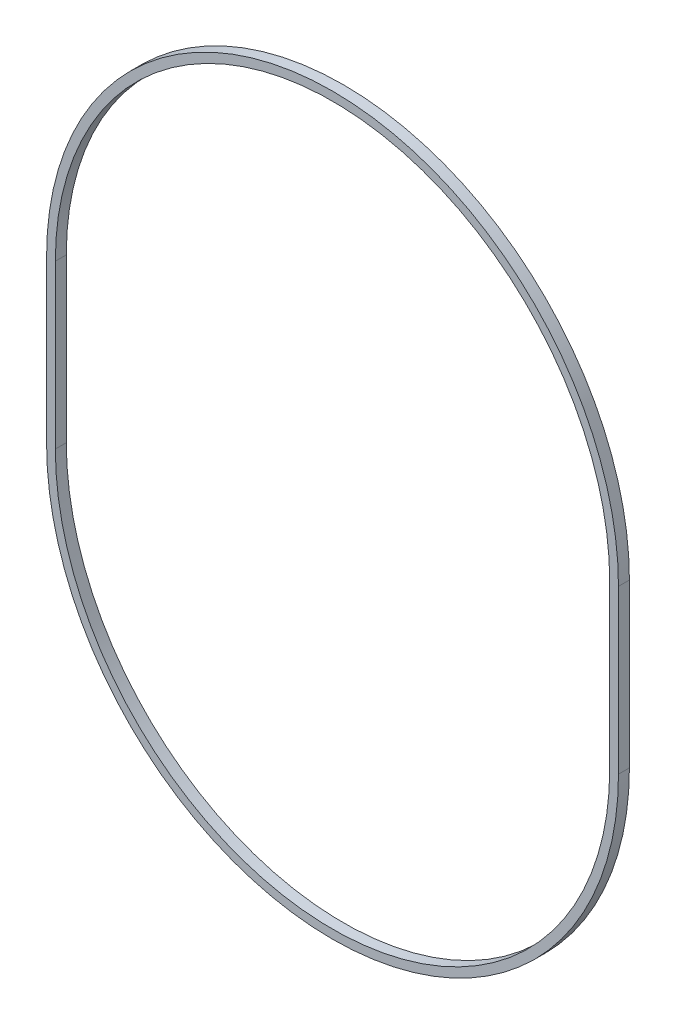
ISO-10303-21;
HEADER;
FILE_DESCRIPTION(('STEP AP214'),'2;1');
FILE_NAME('part.step','',(''),(''),'','','');
FILE_SCHEMA(('AUTOMOTIVE_DESIGN { 1 0 10303 214 1 1 1 1 }'));
ENDSEC;
DATA;
#1=APPLICATION_CONTEXT('core data for automotive mechanical design processes');
#2=APPLICATION_PROTOCOL_DEFINITION('international standard','automotive_design',2000,#1);
#3=PRODUCT_CONTEXT('',#1,'mechanical');
#4=PRODUCT('Part','Part','',(#3));
#5=PRODUCT_RELATED_PRODUCT_CATEGORY('part','',(#4));
#6=PRODUCT_DEFINITION_FORMATION('','',#4);
#7=PRODUCT_DEFINITION_CONTEXT('part definition',#1,'design');
#8=PRODUCT_DEFINITION('design','',#6,#7);
#9=PRODUCT_DEFINITION_SHAPE('','',#8);
#10=(LENGTH_UNIT() NAMED_UNIT(*) SI_UNIT(.MILLI.,.METRE.));
#11=(NAMED_UNIT(*) PLANE_ANGLE_UNIT() SI_UNIT($,.RADIAN.));
#12=(NAMED_UNIT(*) SI_UNIT($,.STERADIAN.) SOLID_ANGLE_UNIT());
#13=UNCERTAINTY_MEASURE_WITH_UNIT(LENGTH_MEASURE(1.E-05),#10,'distance_accuracy_value','');
#14=(GEOMETRIC_REPRESENTATION_CONTEXT(3) GLOBAL_UNCERTAINTY_ASSIGNED_CONTEXT((#13)) GLOBAL_UNIT_ASSIGNED_CONTEXT((#10,
#11,#12)) REPRESENTATION_CONTEXT('',''));
#15=CARTESIAN_POINT('',(0.,0.,0.));
#16=DIRECTION('',(0.,0.,1.));
#17=DIRECTION('',(1.,0.,0.));
#18=AXIS2_PLACEMENT_3D('',#15,#16,#17);
#19=CARTESIAN_POINT('',(-98.,0.,1.875));
#20=DIRECTION('',(1.,0.,0.));
#21=DIRECTION('',(0.,0.,-1.));
#22=AXIS2_PLACEMENT_3D('',#19,#20,#21);
#23=PLANE('',#22);
#24=DIRECTION('',(0.,-1.,0.));
#25=VECTOR('',#24,1.);
#26=CARTESIAN_POINT('',(-98.,0.,-1.875));
#27=LINE('',#26,#25);
#28=CARTESIAN_POINT('',(-98.,27.875,-1.875));
#29=VERTEX_POINT('',#28);
#30=CARTESIAN_POINT('',(-98.,-27.875,-1.875));
#31=VERTEX_POINT('',#30);
#32=EDGE_CURVE('E150',#29,#31,#27,.T.);
#33=ORIENTED_EDGE('',*,*,#32,.T.);
#34=DIRECTION('',(0.,0.,-1.));
#35=VECTOR('',#34,1.);
#36=CARTESIAN_POINT('',(-98.,-27.875,1.875));
#37=LINE('',#36,#35);
#38=CARTESIAN_POINT('',(-98.,-27.875,1.875));
#39=VERTEX_POINT('',#38);
#40=EDGE_CURVE('E11',#39,#31,#37,.T.);
#41=ORIENTED_EDGE('',*,*,#40,.F.);
#42=DIRECTION('',(0.,-1.,0.));
#43=VECTOR('',#42,1.);
#44=CARTESIAN_POINT('',(-98.,0.,1.875));
#45=LINE('',#44,#43);
#46=CARTESIAN_POINT('',(-98.,27.875,1.875));
#47=VERTEX_POINT('',#46);
#48=EDGE_CURVE('E124',#47,#39,#45,.T.);
#49=ORIENTED_EDGE('',*,*,#48,.F.);
#50=DIRECTION('',(0.,0.,-1.));
#51=VECTOR('',#50,1.);
#52=CARTESIAN_POINT('',(-98.,27.875,1.875));
#53=LINE('',#52,#51);
#54=EDGE_CURVE('E157',#47,#29,#53,.T.);
#55=ORIENTED_EDGE('',*,*,#54,.T.);
#56=EDGE_LOOP('',(#33,#41,#49,#55));
#57=FACE_BOUND('',#56,.T.);
#58=ADVANCED_FACE('F43',(#57),#23,.F.);
#59=CARTESIAN_POINT('',(0.,-27.875,1.875));
#60=DIRECTION('',(0.,0.,-1.));
#61=DIRECTION('',(-1.,0.,0.));
#62=AXIS2_PLACEMENT_3D('',#59,#60,#61);
#63=CYLINDRICAL_SURFACE('',#62,98.);
#64=CARTESIAN_POINT('',(0.,-27.875,-1.875));
#65=DIRECTION('',(0.,0.,1.));
#66=DIRECTION('',(1.,0.,0.));
#67=AXIS2_PLACEMENT_3D('',#64,#65,#66);
#68=CIRCLE('',#67,98.);
#69=CARTESIAN_POINT('',(98.,-27.875,-1.875));
#70=VERTEX_POINT('',#69);
#71=EDGE_CURVE('E129',#31,#70,#68,.T.);
#72=ORIENTED_EDGE('',*,*,#71,.T.);
#73=DIRECTION('',(0.,0.,-1.));
#74=VECTOR('',#73,1.);
#75=CARTESIAN_POINT('',(98.,-27.875,1.875));
#76=LINE('',#75,#74);
#77=CARTESIAN_POINT('',(98.,-27.875,1.875));
#78=VERTEX_POINT('',#77);
#79=EDGE_CURVE('E53',#78,#70,#76,.T.);
#80=ORIENTED_EDGE('',*,*,#79,.F.);
#81=CARTESIAN_POINT('',(0.,-27.875,1.875));
#82=DIRECTION('',(0.,0.,1.));
#83=DIRECTION('',(1.,0.,0.));
#84=AXIS2_PLACEMENT_3D('',#81,#82,#83);
#85=CIRCLE('',#84,98.);
#86=EDGE_CURVE('E118',#39,#78,#85,.T.);
#87=ORIENTED_EDGE('',*,*,#86,.F.);
#88=ORIENTED_EDGE('',*,*,#40,.T.);
#89=EDGE_LOOP('',(#72,#80,#87,#88));
#90=FACE_BOUND('',#89,.T.);
#91=ADVANCED_FACE('F128',(#90),#63,.T.);
#92=CARTESIAN_POINT('',(98.,0.,1.875));
#93=DIRECTION('',(-1.,0.,0.));
#94=DIRECTION('',(0.,0.,1.));
#95=AXIS2_PLACEMENT_3D('',#92,#93,#94);
#96=PLANE('',#95);
#97=DIRECTION('',(0.,1.,0.));
#98=VECTOR('',#97,1.);
#99=CARTESIAN_POINT('',(98.,0.,-1.875));
#100=LINE('',#99,#98);
#101=CARTESIAN_POINT('',(98.,27.875,-1.875));
#102=VERTEX_POINT('',#101);
#103=EDGE_CURVE('E91',#70,#102,#100,.T.);
#104=ORIENTED_EDGE('',*,*,#103,.T.);
#105=DIRECTION('',(0.,0.,-1.));
#106=VECTOR('',#105,1.);
#107=CARTESIAN_POINT('',(98.,27.875,1.875));
#108=LINE('',#107,#106);
#109=CARTESIAN_POINT('',(98.,27.875,1.875));
#110=VERTEX_POINT('',#109);
#111=EDGE_CURVE('E130',#110,#102,#108,.T.);
#112=ORIENTED_EDGE('',*,*,#111,.F.);
#113=DIRECTION('',(0.,1.,0.));
#114=VECTOR('',#113,1.);
#115=CARTESIAN_POINT('',(98.,0.,1.875));
#116=LINE('',#115,#114);
#117=EDGE_CURVE('E122',#78,#110,#116,.T.);
#118=ORIENTED_EDGE('',*,*,#117,.F.);
#119=ORIENTED_EDGE('',*,*,#79,.T.);
#120=EDGE_LOOP('',(#104,#112,#118,#119));
#121=FACE_BOUND('',#120,.T.);
#122=ADVANCED_FACE('F132',(#121),#96,.F.);
#123=CARTESIAN_POINT('',(0.,-27.875,1.875));
#124=DIRECTION('',(0.,0.,-1.));
#125=DIRECTION('',(-1.,0.,0.));
#126=AXIS2_PLACEMENT_3D('',#123,#124,#125);
#127=CYLINDRICAL_SURFACE('',#126,95.);
#128=CARTESIAN_POINT('',(0.,-27.875,-1.875));
#129=DIRECTION('',(0.,0.,1.));
#130=DIRECTION('',(1.,0.,0.));
#131=AXIS2_PLACEMENT_3D('',#128,#129,#130);
#132=CIRCLE('',#131,95.);
#133=CARTESIAN_POINT('',(-95.,-27.875,-1.875));
#134=VERTEX_POINT('',#133);
#135=CARTESIAN_POINT('',(95.,-27.875,-1.875));
#136=VERTEX_POINT('',#135);
#137=EDGE_CURVE('E138',#134,#136,#132,.T.);
#138=ORIENTED_EDGE('',*,*,#137,.F.);
#139=DIRECTION('',(0.,0.,-1.));
#140=VECTOR('',#139,1.);
#141=CARTESIAN_POINT('',(-95.,-27.875,1.875));
#142=LINE('',#141,#140);
#143=CARTESIAN_POINT('',(-95.,-27.875,1.875));
#144=VERTEX_POINT('',#143);
#145=EDGE_CURVE('E47',#144,#134,#142,.T.);
#146=ORIENTED_EDGE('',*,*,#145,.F.);
#147=CARTESIAN_POINT('',(0.,-27.875,1.875));
#148=DIRECTION('',(0.,0.,1.));
#149=DIRECTION('',(1.,0.,0.));
#150=AXIS2_PLACEMENT_3D('',#147,#148,#149);
#151=CIRCLE('',#150,95.);
#152=CARTESIAN_POINT('',(95.,-27.875,1.875));
#153=VERTEX_POINT('',#152);
#154=EDGE_CURVE('E156',#144,#153,#151,.T.);
#155=ORIENTED_EDGE('',*,*,#154,.T.);
#156=DIRECTION('',(0.,0.,-1.));
#157=VECTOR('',#156,1.);
#158=CARTESIAN_POINT('',(95.,-27.875,1.875));
#159=LINE('',#158,#157);
#160=EDGE_CURVE('E134',#153,#136,#159,.T.);
#161=ORIENTED_EDGE('',*,*,#160,.T.);
#162=EDGE_LOOP('',(#138,#146,#155,#161));
#163=FACE_BOUND('',#162,.T.);
#164=ADVANCED_FACE('F45',(#163),#127,.F.);
#165=CARTESIAN_POINT('',(-95.,0.,1.875));
#166=DIRECTION('',(1.,0.,0.));
#167=DIRECTION('',(0.,1.,0.));
#168=AXIS2_PLACEMENT_3D('',#165,#166,#167);
#169=PLANE('',#168);
#170=DIRECTION('',(0.,-1.,0.));
#171=VECTOR('',#170,1.);
#172=CARTESIAN_POINT('',(-95.,0.,-1.875));
#173=LINE('',#172,#171);
#174=CARTESIAN_POINT('',(-95.,27.875,-1.875));
#175=VERTEX_POINT('',#174);
#176=EDGE_CURVE('E141',#175,#134,#173,.T.);
#177=ORIENTED_EDGE('',*,*,#176,.F.);
#178=DIRECTION('',(0.,0.,-1.));
#179=VECTOR('',#178,1.);
#180=CARTESIAN_POINT('',(-95.,27.875,1.875));
#181=LINE('',#180,#179);
#182=CARTESIAN_POINT('',(-95.,27.875,1.875));
#183=VERTEX_POINT('',#182);
#184=EDGE_CURVE('E162',#183,#175,#181,.T.);
#185=ORIENTED_EDGE('',*,*,#184,.F.);
#186=DIRECTION('',(0.,-1.,0.));
#187=VECTOR('',#186,1.);
#188=CARTESIAN_POINT('',(-95.,0.,1.875));
#189=LINE('',#188,#187);
#190=EDGE_CURVE('E171',#183,#144,#189,.T.);
#191=ORIENTED_EDGE('',*,*,#190,.T.);
#192=ORIENTED_EDGE('',*,*,#145,.T.);
#193=EDGE_LOOP('',(#177,#185,#191,#192));
#194=FACE_BOUND('',#193,.T.);
#195=ADVANCED_FACE('F169',(#194),#169,.T.);
#196=CARTESIAN_POINT('',(0.,27.875,1.875));
#197=DIRECTION('',(0.,0.,-1.));
#198=DIRECTION('',(-1.,0.,0.));
#199=AXIS2_PLACEMENT_3D('',#196,#197,#198);
#200=CYLINDRICAL_SURFACE('',#199,95.);
#201=CARTESIAN_POINT('',(0.,27.875,-1.875));
#202=DIRECTION('',(0.,0.,1.));
#203=DIRECTION('',(1.,0.,0.));
#204=AXIS2_PLACEMENT_3D('',#201,#202,#203);
#205=CIRCLE('',#204,95.);
#206=CARTESIAN_POINT('',(95.,27.875,-1.875));
#207=VERTEX_POINT('',#206);
#208=EDGE_CURVE('E144',#207,#175,#205,.T.);
#209=ORIENTED_EDGE('',*,*,#208,.F.);
#210=DIRECTION('',(0.,0.,-1.));
#211=VECTOR('',#210,1.);
#212=CARTESIAN_POINT('',(95.,27.875,1.875));
#213=LINE('',#212,#211);
#214=CARTESIAN_POINT('',(95.,27.875,1.875));
#215=VERTEX_POINT('',#214);
#216=EDGE_CURVE('E161',#215,#207,#213,.T.);
#217=ORIENTED_EDGE('',*,*,#216,.F.);
#218=CARTESIAN_POINT('',(0.,27.875,1.875));
#219=DIRECTION('',(0.,0.,1.));
#220=DIRECTION('',(1.,0.,0.));
#221=AXIS2_PLACEMENT_3D('',#218,#219,#220);
#222=CIRCLE('',#221,95.);
#223=EDGE_CURVE('E178',#215,#183,#222,.T.);
#224=ORIENTED_EDGE('',*,*,#223,.T.);
#225=ORIENTED_EDGE('',*,*,#184,.T.);
#226=EDGE_LOOP('',(#209,#217,#224,#225));
#227=FACE_BOUND('',#226,.T.);
#228=ADVANCED_FACE('F176',(#227),#200,.F.);
#229=CARTESIAN_POINT('',(95.,0.,1.875));
#230=DIRECTION('',(-1.,0.,0.));
#231=DIRECTION('',(0.,-1.,0.));
#232=AXIS2_PLACEMENT_3D('',#229,#230,#231);
#233=PLANE('',#232);
#234=DIRECTION('',(0.,1.,0.));
#235=VECTOR('',#234,1.);
#236=CARTESIAN_POINT('',(95.,0.,-1.875));
#237=LINE('',#236,#235);
#238=EDGE_CURVE('E147',#136,#207,#237,.T.);
#239=ORIENTED_EDGE('',*,*,#238,.F.);
#240=ORIENTED_EDGE('',*,*,#160,.F.);
#241=DIRECTION('',(0.,1.,0.));
#242=VECTOR('',#241,1.);
#243=CARTESIAN_POINT('',(95.,0.,1.875));
#244=LINE('',#243,#242);
#245=EDGE_CURVE('E183',#153,#215,#244,.T.);
#246=ORIENTED_EDGE('',*,*,#245,.T.);
#247=ORIENTED_EDGE('',*,*,#216,.T.);
#248=EDGE_LOOP('',(#239,#240,#246,#247));
#249=FACE_BOUND('',#248,.T.);
#250=ADVANCED_FACE('F185',(#249),#233,.T.);
#251=CARTESIAN_POINT('',(0.,27.875,1.875));
#252=DIRECTION('',(0.,0.,-1.));
#253=DIRECTION('',(-1.,0.,0.));
#254=AXIS2_PLACEMENT_3D('',#251,#252,#253);
#255=CYLINDRICAL_SURFACE('',#254,98.);
#256=CARTESIAN_POINT('',(0.,27.875,-1.875));
#257=DIRECTION('',(0.,0.,1.));
#258=DIRECTION('',(1.,0.,0.));
#259=AXIS2_PLACEMENT_3D('',#256,#257,#258);
#260=CIRCLE('',#259,98.);
#261=EDGE_CURVE('E97',#102,#29,#260,.T.);
#262=ORIENTED_EDGE('',*,*,#261,.T.);
#263=ORIENTED_EDGE('',*,*,#54,.F.);
#264=CARTESIAN_POINT('',(0.,27.875,1.875));
#265=DIRECTION('',(0.,0.,1.));
#266=DIRECTION('',(1.,0.,0.));
#267=AXIS2_PLACEMENT_3D('',#264,#265,#266);
#268=CIRCLE('',#267,98.);
#269=EDGE_CURVE('E62',#110,#47,#268,.T.);
#270=ORIENTED_EDGE('',*,*,#269,.F.);
#271=ORIENTED_EDGE('',*,*,#111,.T.);
#272=EDGE_LOOP('',(#262,#263,#270,#271));
#273=FACE_BOUND('',#272,.T.);
#274=ADVANCED_FACE('F190',(#273),#255,.T.);
#275=CARTESIAN_POINT('',(0.,0.,1.875));
#276=DIRECTION('',(0.,0.,1.));
#277=DIRECTION('',(1.,0.,0.));
#278=AXIS2_PLACEMENT_3D('',#275,#276,#277);
#279=PLANE('',#278);
#280=ORIENTED_EDGE('',*,*,#154,.F.);
#281=ORIENTED_EDGE('',*,*,#190,.F.);
#282=ORIENTED_EDGE('',*,*,#223,.F.);
#283=ORIENTED_EDGE('',*,*,#245,.F.);
#284=EDGE_LOOP('',(#280,#281,#282,#283));
#285=FACE_BOUND('',#284,.T.);
#286=ORIENTED_EDGE('',*,*,#48,.T.);
#287=ORIENTED_EDGE('',*,*,#86,.T.);
#288=ORIENTED_EDGE('',*,*,#117,.T.);
#289=ORIENTED_EDGE('',*,*,#269,.T.);
#290=EDGE_LOOP('',(#286,#287,#288,#289));
#291=FACE_BOUND('',#290,.T.);
#292=ADVANCED_FACE('F120',(#285,#291),#279,.T.);
#293=CARTESIAN_POINT('',(0.,0.,-1.875));
#294=DIRECTION('',(0.,0.,1.));
#295=DIRECTION('',(1.,0.,0.));
#296=AXIS2_PLACEMENT_3D('',#293,#294,#295);
#297=PLANE('',#296);
#298=ORIENTED_EDGE('',*,*,#137,.T.);
#299=ORIENTED_EDGE('',*,*,#238,.T.);
#300=ORIENTED_EDGE('',*,*,#208,.T.);
#301=ORIENTED_EDGE('',*,*,#176,.T.);
#302=EDGE_LOOP('',(#298,#299,#300,#301));
#303=FACE_BOUND('',#302,.T.);
#304=ORIENTED_EDGE('',*,*,#32,.F.);
#305=ORIENTED_EDGE('',*,*,#261,.F.);
#306=ORIENTED_EDGE('',*,*,#103,.F.);
#307=ORIENTED_EDGE('',*,*,#71,.F.);
#308=EDGE_LOOP('',(#304,#305,#306,#307));
#309=FACE_BOUND('',#308,.T.);
#310=ADVANCED_FACE('F174',(#303,#309),#297,.F.);
#311=CLOSED_SHELL('',(#58,#91,#122,#164,#195,#228,#250,#274,#292,#310));
#312=MANIFOLD_SOLID_BREP('B2',#311);
#313=ADVANCED_BREP_SHAPE_REPRESENTATION('',(#18,#312),#14);
#314=SHAPE_DEFINITION_REPRESENTATION(#9,#313);
ENDSEC;
END-ISO-10303-21;
